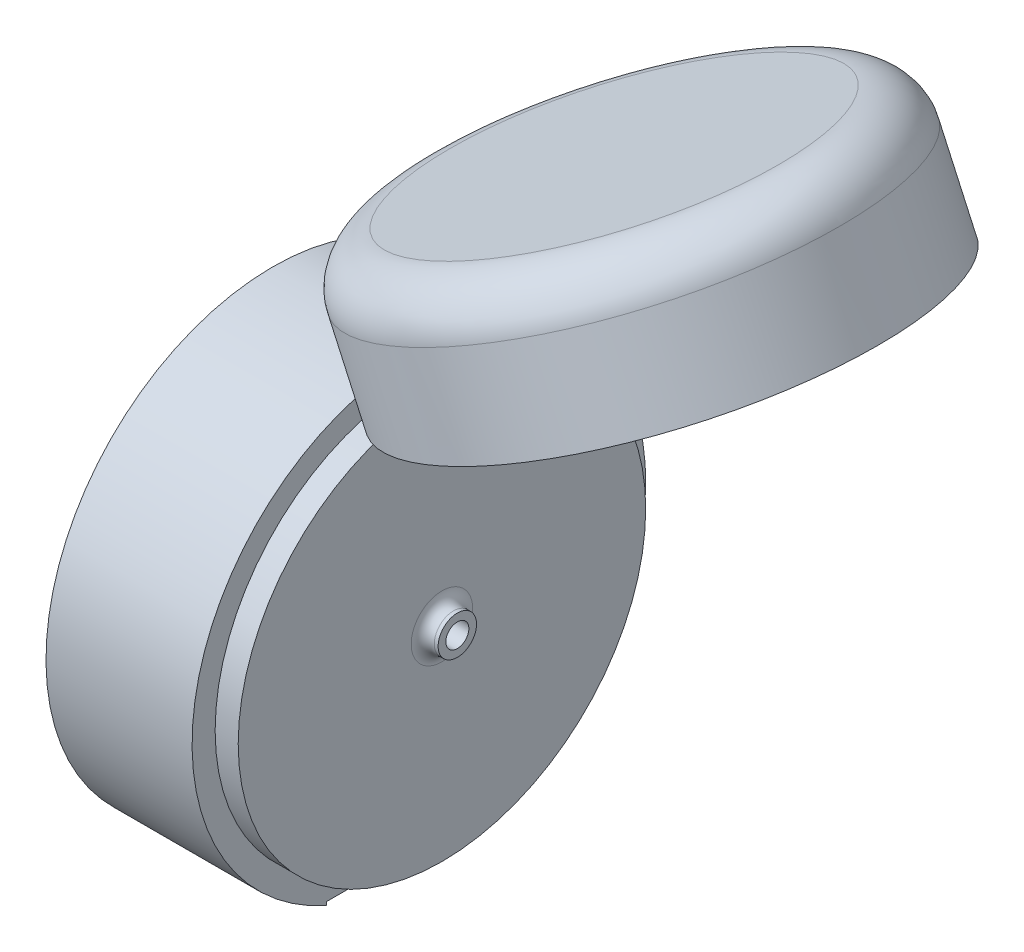
ISO-10303-21;
HEADER;
FILE_DESCRIPTION(('STEP AP214'),'2;1');
FILE_NAME('part.step','',(''),(''),'','','');
FILE_SCHEMA(('AUTOMOTIVE_DESIGN { 1 0 10303 214 1 1 1 1 }'));
ENDSEC;
DATA;
#1=APPLICATION_CONTEXT('core data for automotive mechanical design processes');
#2=APPLICATION_PROTOCOL_DEFINITION('international standard','automotive_design',2000,#1);
#3=PRODUCT_CONTEXT('',#1,'mechanical');
#4=PRODUCT('Part','Part','',(#3));
#5=PRODUCT_RELATED_PRODUCT_CATEGORY('part','',(#4));
#6=PRODUCT_DEFINITION_FORMATION('','',#4);
#7=PRODUCT_DEFINITION_CONTEXT('part definition',#1,'design');
#8=PRODUCT_DEFINITION('design','',#6,#7);
#9=PRODUCT_DEFINITION_SHAPE('','',#8);
#10=(LENGTH_UNIT() NAMED_UNIT(*) SI_UNIT(.MILLI.,.METRE.));
#11=(NAMED_UNIT(*) PLANE_ANGLE_UNIT() SI_UNIT($,.RADIAN.));
#12=(NAMED_UNIT(*) SI_UNIT($,.STERADIAN.) SOLID_ANGLE_UNIT());
#13=UNCERTAINTY_MEASURE_WITH_UNIT(LENGTH_MEASURE(1.E-05),#10,'distance_accuracy_value','');
#14=(GEOMETRIC_REPRESENTATION_CONTEXT(3) GLOBAL_UNCERTAINTY_ASSIGNED_CONTEXT((#13)) GLOBAL_UNIT_ASSIGNED_CONTEXT((#10,
#11,#12)) REPRESENTATION_CONTEXT('',''));
#15=CARTESIAN_POINT('',(0.,0.,0.));
#16=DIRECTION('',(0.,0.,1.));
#17=DIRECTION('',(1.,0.,0.));
#18=AXIS2_PLACEMENT_3D('',#15,#16,#17);
#19=CARTESIAN_POINT('',(9.5,0.,0.));
#20=DIRECTION('',(-1.,0.,0.));
#21=DIRECTION('',(0.,0.,1.));
#22=AXIS2_PLACEMENT_3D('',#19,#20,#21);
#23=CYLINDRICAL_SURFACE('',#22,14.75);
#24=CARTESIAN_POINT('',(0.,0.,0.));
#25=DIRECTION('',(1.,0.,0.));
#26=DIRECTION('',(0.,0.,-1.));
#27=AXIS2_PLACEMENT_3D('',#24,#25,#26);
#28=CIRCLE('',#27,14.75);
#29=CARTESIAN_POINT('',(0.,0.,-14.75));
#30=VERTEX_POINT('',#29);
#31=EDGE_CURVE('E394',#30,#30,#28,.T.);
#32=ORIENTED_EDGE('',*,*,#31,.T.);
#33=EDGE_LOOP('',(#32));
#34=FACE_BOUND('',#33,.T.);
#35=CARTESIAN_POINT('',(2.,0.,0.));
#36=DIRECTION('',(1.,0.,0.));
#37=DIRECTION('',(0.,0.,-1.));
#38=AXIS2_PLACEMENT_3D('',#35,#36,#37);
#39=CIRCLE('',#38,14.75);
#40=CARTESIAN_POINT('',(2.,-14.7160626527614,1.));
#41=VERTEX_POINT('',#40);
#42=CARTESIAN_POINT('',(2.,-14.7160626527614,-1.));
#43=VERTEX_POINT('',#42);
#44=EDGE_CURVE('E365',#41,#43,#39,.T.);
#45=ORIENTED_EDGE('',*,*,#44,.F.);
#46=CARTESIAN_POINT('',(2.,-14.7160626527614,1.));
#47=CARTESIAN_POINT('',(2.0281221774908,-14.7086683335928,1.10896231716254));
#48=CARTESIAN_POINT('',(2.06084206750302,-14.7001253458484,1.21664592471567));
#49=CARTESIAN_POINT('',(2.13514850023795,-14.681027448218,1.42870103315908));
#50=CARTESIAN_POINT('',(2.17673315523214,-14.6704729667251,1.53307323377716));
#51=CARTESIAN_POINT('',(2.26840121611016,-14.6476469003942,1.73768316659525));
#52=CARTESIAN_POINT('',(2.31847505026421,-14.635377252147,1.8379253989135));
#53=CARTESIAN_POINT('',(2.42674332777425,-14.6094595051699,2.0337051412248));
#54=CARTESIAN_POINT('',(2.48493793291973,-14.5958113789782,2.12924255743284));
#55=CARTESIAN_POINT('',(2.67107821477595,-14.5533529923813,2.40781797824088));
#56=CARTESIAN_POINT('',(2.81067277434549,-14.523004673537,2.58302452696941));
#57=CARTESIAN_POINT('',(3.11687790135848,-14.4615423272579,2.90751597757197));
#58=CARTESIAN_POINT('',(3.28347068604907,-14.4304288151933,3.05681780881786));
#59=CARTESIAN_POINT('',(3.58266998299508,-14.3803254846725,3.28292381521356));
#60=CARTESIAN_POINT('',(3.70922269109669,-14.3606282429431,3.36767958954601));
#61=CARTESIAN_POINT('',(3.97127090818296,-14.323480104072,3.5223079634277));
#62=CARTESIAN_POINT('',(4.1067587059451,-14.306027307321,3.59219318206383));
#63=CARTESIAN_POINT('',(4.24603677390421,-14.2901873727789,3.6541818305704));
#64=B_SPLINE_CURVE_WITH_KNOTS('',3,(#46,#47,#48,#49,#50,#51,#52,#53,#54,#55,#56,#57,#58,#59,#60,
#61,#62,#63),.UNSPECIFIED.,.F.,.F.,(4,2,2,2,2,2,2,2,4),(0.,0.338199503792019,0.676327060698384,
1.01407587676397,1.35183142273411,2.02667156748196,2.70106901265029,3.16086841590994,
3.62027606550659),.UNSPECIFIED.);
#65=CARTESIAN_POINT('',(4.24603677390421,-14.2901873727789,3.6541818305704));
#66=VERTEX_POINT('',#65);
#67=EDGE_CURVE('E311',#41,#66,#64,.T.);
#68=ORIENTED_EDGE('',*,*,#67,.T.);
#69=CARTESIAN_POINT('',(-3.96138999608952,0.,0.));
#70=DIRECTION('',(-0.406736643075801,0.,0.9135454576426));
#71=DIRECTION('',(-0.913545457642601,0.,-0.406736643075801));
#72=AXIS2_PLACEMENT_3D('',#69,#70,#71);
#73=ELLIPSE('',#72,36.2642516997199,14.75);
#74=CARTESIAN_POINT('',(9.5,-13.477451270748,5.99339697038443));
#75=VERTEX_POINT('',#74);
#76=EDGE_CURVE('E193',#66,#75,#73,.T.);
#77=ORIENTED_EDGE('',*,*,#76,.T.);
#78=CARTESIAN_POINT('',(9.5,0.,0.));
#79=DIRECTION('',(1.,0.,0.));
#80=DIRECTION('',(0.,0.,-1.));
#81=AXIS2_PLACEMENT_3D('',#78,#79,#80);
#82=CIRCLE('',#81,14.75);
#83=CARTESIAN_POINT('',(9.5,14.479000955853,2.81443268180418));
#84=VERTEX_POINT('',#83);
#85=EDGE_CURVE('E184',#84,#75,#82,.T.);
#86=ORIENTED_EDGE('',*,*,#85,.F.);
#87=DIRECTION('',(-1.,0.,0.));
#88=VECTOR('',#87,1.);
#89=CARTESIAN_POINT('',(0.,14.479000955853,2.81443268180418));
#90=LINE('',#89,#88);
#91=CARTESIAN_POINT('',(8.,14.479000955853,2.81443268180418));
#92=VERTEX_POINT('',#91);
#93=EDGE_CURVE('E419',#84,#92,#90,.T.);
#94=ORIENTED_EDGE('',*,*,#93,.T.);
#95=CARTESIAN_POINT('',(8.,0.,0.));
#96=DIRECTION('',(1.,0.,0.));
#97=DIRECTION('',(0.,0.,-1.));
#98=AXIS2_PLACEMENT_3D('',#95,#96,#97);
#99=CIRCLE('',#98,14.75);
#100=CARTESIAN_POINT('',(8.,14.479000955853,-2.81443268180418));
#101=VERTEX_POINT('',#100);
#102=EDGE_CURVE('E417',#101,#92,#99,.T.);
#103=ORIENTED_EDGE('',*,*,#102,.F.);
#104=DIRECTION('',(-1.,0.,0.));
#105=VECTOR('',#104,1.);
#106=CARTESIAN_POINT('',(0.,14.479000955853,-2.81443268180418));
#107=LINE('',#106,#105);
#108=CARTESIAN_POINT('',(9.5,14.479000955853,-2.81443268180418));
#109=VERTEX_POINT('',#108);
#110=EDGE_CURVE('E389',#109,#101,#107,.T.);
#111=ORIENTED_EDGE('',*,*,#110,.F.);
#112=CARTESIAN_POINT('',(9.5,-13.477451270748,-5.99339697038443));
#113=VERTEX_POINT('',#112);
#114=EDGE_CURVE('E390',#113,#109,#82,.T.);
#115=ORIENTED_EDGE('',*,*,#114,.F.);
#116=CARTESIAN_POINT('',(-3.96138999608952,0.,0.));
#117=DIRECTION('',(0.406736643075801,0.,0.9135454576426));
#118=DIRECTION('',(-0.913545457642601,0.,0.406736643075801));
#119=AXIS2_PLACEMENT_3D('',#116,#117,#118);
#120=ELLIPSE('',#119,36.2642516997199,14.75);
#121=CARTESIAN_POINT('',(4.24603677390421,-14.2901873727789,-3.6541818305704));
#122=VERTEX_POINT('',#121);
#123=EDGE_CURVE('E196',#122,#113,#120,.T.);
#124=ORIENTED_EDGE('',*,*,#123,.F.);
#125=CARTESIAN_POINT('',(2.,-14.7160626527614,-1.));
#126=CARTESIAN_POINT('',(2.0281221774908,-14.7086683335928,-1.10896231716254));
#127=CARTESIAN_POINT('',(2.06084206750302,-14.7001253458484,-1.21664592471567));
#128=CARTESIAN_POINT('',(2.13514850023795,-14.681027448218,-1.42870103315908));
#129=CARTESIAN_POINT('',(2.17673315523214,-14.6704729667251,-1.53307323377716));
#130=CARTESIAN_POINT('',(2.26840121611016,-14.6476469003942,-1.73768316659525));
#131=CARTESIAN_POINT('',(2.31847505026421,-14.635377252147,-1.8379253989135));
#132=CARTESIAN_POINT('',(2.42674332777425,-14.6094595051699,-2.0337051412248));
#133=CARTESIAN_POINT('',(2.48493793291973,-14.5958113789782,-2.12924255743284));
#134=CARTESIAN_POINT('',(2.67107821477595,-14.5533529923813,-2.40781797824088));
#135=CARTESIAN_POINT('',(2.81067277434548,-14.523004673537,-2.58302452696941));
#136=CARTESIAN_POINT('',(3.11687790135848,-14.4615423272579,-2.90751597757197));
#137=CARTESIAN_POINT('',(3.28347068604907,-14.4304288151933,-3.05681780881786));
#138=CARTESIAN_POINT('',(3.58266998299508,-14.3803254846725,-3.28292381521356));
#139=CARTESIAN_POINT('',(3.70922269109669,-14.3606282429431,-3.36767958954601));
#140=CARTESIAN_POINT('',(3.97127090818296,-14.323480104072,-3.5223079634277));
#141=CARTESIAN_POINT('',(4.1067587059451,-14.306027307321,-3.59219318206383));
#142=CARTESIAN_POINT('',(4.24603677390421,-14.2901873727789,-3.6541818305704));
#143=B_SPLINE_CURVE_WITH_KNOTS('',3,(#125,#126,#127,#128,#129,#130,#131,#132,#133,#134,#135,
#136,#137,#138,#139,#140,#141,#142),.UNSPECIFIED.,.F.,.F.,(4,2,2,2,2,2,2,2,4),(0.,
0.33819950379202,0.676327060698385,1.01407587676397,1.35183142273411,2.02667156748196,
2.70106901265029,3.16086841590994,3.62027606550659),.UNSPECIFIED.);
#144=EDGE_CURVE('E303',#43,#122,#143,.T.);
#145=ORIENTED_EDGE('',*,*,#144,.F.);
#146=EDGE_LOOP('',(#45,#68,#77,#86,#94,#103,#111,#115,#124,#145));
#147=FACE_BOUND('',#146,.T.);
#148=ADVANCED_FACE('F56',(#34,#147),#23,.T.);
#149=CARTESIAN_POINT('',(9.5,0.,0.));
#150=DIRECTION('',(1.,0.,0.));
#151=DIRECTION('',(0.,0.,-1.));
#152=AXIS2_PLACEMENT_3D('',#149,#150,#151);
#153=PLANE('',#152);
#154=DIRECTION('',(0.,0.,1.));
#155=VECTOR('',#154,1.);
#156=CARTESIAN_POINT('',(9.5,-13.25,0.));
#157=LINE('',#156,#155);
#158=CARTESIAN_POINT('',(9.5,-13.25,-5.99339697038443));
#159=VERTEX_POINT('',#158);
#160=CARTESIAN_POINT('',(9.5,-13.25,0.));
#161=VERTEX_POINT('',#160);
#162=EDGE_CURVE('E167',#159,#161,#157,.T.);
#163=ORIENTED_EDGE('',*,*,#162,.F.);
#164=DIRECTION('',(0.,-1.,0.));
#165=VECTOR('',#164,1.);
#166=CARTESIAN_POINT('',(9.5,-13.25,-5.99339697038443));
#167=LINE('',#166,#165);
#168=EDGE_CURVE('E197',#159,#113,#167,.T.);
#169=ORIENTED_EDGE('',*,*,#168,.T.);
#170=ORIENTED_EDGE('',*,*,#114,.T.);
#171=DIRECTION('',(0.,0.981627183447662,-0.190808995376554));
#172=VECTOR('',#171,1.);
#173=CARTESIAN_POINT('',(9.5,0.,0.));
#174=LINE('',#173,#172);
#175=CARTESIAN_POINT('',(9.5,15.9514417310245,-3.10064617486901));
#176=VERTEX_POINT('',#175);
#177=EDGE_CURVE('E450',#109,#176,#174,.T.);
#178=ORIENTED_EDGE('',*,*,#177,.T.);
#179=CARTESIAN_POINT('',(9.5,0.,0.));
#180=DIRECTION('',(1.,0.,0.));
#181=DIRECTION('',(0.,0.,-1.));
#182=AXIS2_PLACEMENT_3D('',#179,#180,#181);
#183=CIRCLE('',#182,16.25);
#184=CARTESIAN_POINT('',(9.5,15.9514417310245,3.10064617486901));
#185=VERTEX_POINT('',#184);
#186=EDGE_CURVE('E446',#176,#185,#183,.T.);
#187=ORIENTED_EDGE('',*,*,#186,.T.);
#188=DIRECTION('',(0.,0.981627183447662,0.190808995376554));
#189=VECTOR('',#188,1.);
#190=CARTESIAN_POINT('',(9.5,0.,0.));
#191=LINE('',#190,#189);
#192=EDGE_CURVE('E422',#84,#185,#191,.T.);
#193=ORIENTED_EDGE('',*,*,#192,.F.);
#194=ORIENTED_EDGE('',*,*,#85,.T.);
#195=DIRECTION('',(0.,-1.,0.));
#196=VECTOR('',#195,1.);
#197=CARTESIAN_POINT('',(9.5,-13.25,5.99339697038443));
#198=LINE('',#197,#196);
#199=CARTESIAN_POINT('',(9.5,-13.25,5.99339697038443));
#200=VERTEX_POINT('',#199);
#201=EDGE_CURVE('E73',#200,#75,#198,.T.);
#202=ORIENTED_EDGE('',*,*,#201,.F.);
#203=EDGE_CURVE('E165',#161,#200,#157,.T.);
#204=ORIENTED_EDGE('',*,*,#203,.F.);
#205=CARTESIAN_POINT('',(9.5,0.,0.));
#206=DIRECTION('',(1.,0.,0.));
#207=DIRECTION('',(0.,0.,-1.));
#208=AXIS2_PLACEMENT_3D('',#205,#206,#207);
#209=CIRCLE('',#208,13.25);
#210=EDGE_CURVE('E395',#161,#161,#209,.T.);
#211=ORIENTED_EDGE('',*,*,#210,.F.);
#212=EDGE_LOOP('',(#163,#169,#170,#178,#187,#193,#194,#202,#204,#211));
#213=FACE_BOUND('',#212,.T.);
#214=ADVANCED_FACE('F182',(#213),#153,.T.);
#215=CARTESIAN_POINT('',(12.9029318413498,0.,0.));
#216=DIRECTION('',(1.,0.,0.));
#217=DIRECTION('',(0.,0.,-1.));
#218=AXIS2_PLACEMENT_3D('',#215,#216,#217);
#219=CONICAL_SURFACE('',#218,18.2349608713586,0.435992947642129);
#220=CARTESIAN_POINT('',(12.9029903151345,17.8999221557785,3.47959456459471));
#221=CARTESIAN_POINT('',(12.8543674494344,17.9091743068573,3.31329674046829));
#222=CARTESIAN_POINT('',(12.8090853766778,17.9179165528343,3.14601142862205));
#223=CARTESIAN_POINT('',(12.7253750648273,17.9342543827507,2.80966817153869));
#224=CARTESIAN_POINT('',(12.686947288863,17.9418498892021,2.64061010733715));
#225=CARTESIAN_POINT('',(12.5821986447729,17.9627270737572,2.13104439629364));
#226=CARTESIAN_POINT('',(12.5264326088184,17.9740955057353,1.78821382184558));
#227=CARTESIAN_POINT('',(12.4451713310823,17.9907765674522,1.10734482551051));
#228=CARTESIAN_POINT('',(12.4189725680017,17.9962298140188,0.769392767511571));
#229=CARTESIAN_POINT('',(12.3949383577163,18.0012290142844,0.0925325319721335));
#230=CARTESIAN_POINT('',(12.3970912979042,18.0007773865684,-0.246375197269454));
#231=CARTESIAN_POINT('',(12.4250881387634,17.9949613461024,-0.827480178591431));
#232=CARTESIAN_POINT('',(12.4440929148349,17.9910155697877,-1.07004744989232));
#233=CARTESIAN_POINT('',(12.4964996422172,17.9802301738296,-1.55355667885761));
#234=CARTESIAN_POINT('',(12.5299009368585,17.9733906861776,-1.79449871014516));
#235=CARTESIAN_POINT('',(12.6115126943946,17.9568837632327,-2.27820196641815));
#236=CARTESIAN_POINT('',(12.6599779178275,17.9471678272921,-2.5209183652724));
#237=CARTESIAN_POINT('',(12.7710202585832,17.9252932412367,-3.00297946863874));
#238=CARTESIAN_POINT('',(12.8335966219168,17.9131347216383,-3.24232435257253));
#239=CARTESIAN_POINT('',(12.9029903151345,17.8999221557785,-3.47959456459471));
#240=B_SPLINE_CURVE_WITH_KNOTS('',3,(#220,#221,#222,#223,#224,#225,#226,#227,#228,#229,#230,
#231,#232,#233,#234,#235,#236,#237,#238,#239),.UNSPECIFIED.,.F.,.F.,(4,2,2,2,2,2,2,2,2,4),(0.,
0.520448910628168,1.04093297352421,2.08211521273926,3.09796384375708,4.11339640509149,
4.84300446024263,5.57257923925052,6.31523369479725,7.05784847809041),.UNSPECIFIED.);
#241=CARTESIAN_POINT('',(12.9029318413498,17.89993328043,3.47939456459471));
#242=VERTEX_POINT('',#241);
#243=CARTESIAN_POINT('',(12.9029318413498,17.89993328043,-3.47939456459471));
#244=VERTEX_POINT('',#243);
#245=EDGE_CURVE('E249',#242,#244,#240,.T.);
#246=ORIENTED_EDGE('',*,*,#245,.F.);
#247=DIRECTION('',(-0.906451156841727,-0.414551631514919,-0.0805806742874196));
#248=VECTOR('',#247,1.);
#249=CARTESIAN_POINT('',(-4.67922568655713,9.85900130772278,1.91639572198442));
#250=LINE('',#249,#248);
#251=CARTESIAN_POINT('',(10.1835783708246,16.6562783858853,3.23765254173245));
#252=VERTEX_POINT('',#251);
#253=EDGE_CURVE('E484',#242,#252,#250,.T.);
#254=ORIENTED_EDGE('',*,*,#253,.T.);
#255=CARTESIAN_POINT('',(10.1835783708246,0.,0.));
#256=DIRECTION('',(1.,0.,0.));
#257=DIRECTION('',(0.,0.,-1.));
#258=AXIS2_PLACEMENT_3D('',#255,#256,#257);
#259=CIRCLE('',#258,16.9680288675231);
#260=CARTESIAN_POINT('',(10.1835783708246,16.6562783858853,-3.23765254173245));
#261=VERTEX_POINT('',#260);
#262=EDGE_CURVE('E457',#261,#252,#259,.T.);
#263=ORIENTED_EDGE('',*,*,#262,.F.);
#264=DIRECTION('',(-0.906451156841727,-0.414551631514919,0.0805806742874196));
#265=VECTOR('',#264,1.);
#266=CARTESIAN_POINT('',(-4.67922568655713,9.85900130772278,-1.91639572198443));
#267=LINE('',#266,#265);
#268=EDGE_CURVE('E432',#244,#261,#267,.T.);
#269=ORIENTED_EDGE('',*,*,#268,.F.);
#270=EDGE_LOOP('',(#246,#254,#263,#269));
#271=FACE_BOUND('',#270,.T.);
#272=ADVANCED_FACE('F261',(#271),#219,.F.);
#273=CARTESIAN_POINT('',(12.269465839432,0.,0.));
#274=DIRECTION('',(-1.,0.,0.));
#275=DIRECTION('',(0.,0.,1.));
#276=AXIS2_PLACEMENT_3D('',#273,#274,#275);
#277=CONICAL_SURFACE('',#276,19.5946376066212,1.13480337915277);
#278=CARTESIAN_POINT('',(12.9030233082899,17.89973328043,-3.47939456454243));
#279=CARTESIAN_POINT('',(12.7974816942669,18.1305024287753,-3.479383960213));
#280=CARTESIAN_POINT('',(12.6918977636937,18.3612518751685,-3.47918094029057));
#281=CARTESIAN_POINT('',(12.4806452740707,18.8227113539502,-3.47839006927702));
#282=CARTESIAN_POINT('',(12.3749767150247,19.0534213863405,-3.47780221820274));
#283=CARTESIAN_POINT('',(12.269265839432,19.2841117167804,-3.47702195155231));
#284=B_SPLINE_CURVE_WITH_KNOTS('',3,(#278,#279,#280,#281,#282,#283),.UNSPECIFIED.,.F.,.F.,(4,2,
4),(0.,0.761275135288405,1.52255023725048),.UNSPECIFIED.);
#285=CARTESIAN_POINT('',(12.269465839432,19.2836752501048,-3.47702340850744));
#286=VERTEX_POINT('',#285);
#287=EDGE_CURVE('E242',#244,#286,#284,.T.);
#288=ORIENTED_EDGE('',*,*,#287,.F.);
#289=DIRECTION('',(0.42231066794517,-0.889797096023419,0.172959034594885));
#290=VECTOR('',#289,1.);
#291=CARTESIAN_POINT('',(17.5821575279069,8.04093197270724,-1.56299884261028));
#292=LINE('',#291,#290);
#293=CARTESIAN_POINT('',(12.269465839432,19.2346289244652,-3.73883311648704));
#294=VERTEX_POINT('',#293);
#295=EDGE_CURVE('E440',#294,#244,#292,.T.);
#296=ORIENTED_EDGE('',*,*,#295,.F.);
#297=CARTESIAN_POINT('',(12.269465839432,0.,0.));
#298=DIRECTION('',(1.,0.,0.));
#299=DIRECTION('',(0.,0.,-1.));
#300=AXIS2_PLACEMENT_3D('',#297,#298,#299);
#301=CIRCLE('',#300,19.5946376066212);
#302=EDGE_CURVE('E454',#294,#286,#301,.T.);
#303=ORIENTED_EDGE('',*,*,#302,.T.);
#304=EDGE_LOOP('',(#288,#296,#303));
#305=FACE_BOUND('',#304,.T.);
#306=ADVANCED_FACE('F260',(#305),#277,.T.);
#307=CARTESIAN_POINT('',(12.269265839432,19.2841117167804,3.47702195155222));
#308=CARTESIAN_POINT('',(12.3749767150247,19.0534213863405,3.47780221820269));
#309=CARTESIAN_POINT('',(12.4806452740707,18.8227113539502,3.47839006927699));
#310=CARTESIAN_POINT('',(12.6918977636937,18.3612518751685,3.4791809402906));
#311=CARTESIAN_POINT('',(12.7974816942669,18.1305024287753,3.47938396021306));
#312=CARTESIAN_POINT('',(12.9030233082899,17.89973328043,3.4793945645425));
#313=B_SPLINE_CURVE_WITH_KNOTS('',3,(#307,#308,#309,#310,#311,#312),.UNSPECIFIED.,.F.,.F.,(4,2,
4),(0.,0.761275101962074,1.52255023725048),.UNSPECIFIED.);
#314=CARTESIAN_POINT('',(12.269465839432,19.2836752501048,3.47702340850743));
#315=VERTEX_POINT('',#314);
#316=EDGE_CURVE('E218',#315,#242,#313,.T.);
#317=ORIENTED_EDGE('',*,*,#316,.F.);
#318=CARTESIAN_POINT('',(12.269465839432,19.2346289244652,3.73883311648704));
#319=VERTEX_POINT('',#318);
#320=EDGE_CURVE('E453',#315,#319,#301,.T.);
#321=ORIENTED_EDGE('',*,*,#320,.T.);
#322=DIRECTION('',(0.42231066794517,-0.889797096023419,-0.172959034594885));
#323=VECTOR('',#322,1.);
#324=CARTESIAN_POINT('',(17.5821575279069,8.04093197270724,1.56299884261028));
#325=LINE('',#324,#323);
#326=EDGE_CURVE('E481',#319,#242,#325,.T.);
#327=ORIENTED_EDGE('',*,*,#326,.T.);
#328=EDGE_LOOP('',(#317,#321,#327));
#329=FACE_BOUND('',#328,.T.);
#330=ADVANCED_FACE('F259',(#329),#277,.T.);
#331=CARTESIAN_POINT('',(9.5,0.,0.));
#332=DIRECTION('',(1.,0.,0.));
#333=DIRECTION('',(0.,0.,-1.));
#334=AXIS2_PLACEMENT_3D('',#331,#332,#333);
#335=CONICAL_SURFACE('',#334,18.3032144766954,0.436332312998579);
#336=CARTESIAN_POINT('',(12.269665839432,19.2836443649741,-3.47772020158941));
#337=CARTESIAN_POINT('',(12.2207889024844,19.2911938347647,-3.30745625714601));
#338=CARTESIAN_POINT('',(12.1753678147678,19.2983346468691,-3.13620072935886));
#339=CARTESIAN_POINT('',(12.0916045155892,19.3116775119999,-2.79192073427498));
#340=CARTESIAN_POINT('',(12.0532627369126,19.3178795076288,-2.61889615951156));
#341=CARTESIAN_POINT('',(11.949102409555,19.3348959009556,-2.09745610610004));
#342=CARTESIAN_POINT('',(11.89416743728,19.3441177649897,-1.74673870036708));
#343=CARTESIAN_POINT('',(11.8153371200995,19.3574545902254,-1.05020826187473));
#344=CARTESIAN_POINT('',(11.790736642578,19.361685462652,-0.704476134189962));
#345=CARTESIAN_POINT('',(11.7706702826635,19.3651309186228,-0.0122399644828495));
#346=CARTESIAN_POINT('',(11.775192203281,19.3643476022011,0.334263693632252));
#347=CARTESIAN_POINT('',(11.8071390769046,19.3588780881148,0.914698308266651));
#348=CARTESIAN_POINT('',(11.8267565977433,19.3555236561437,1.14910518265975));
#349=CARTESIAN_POINT('',(11.8791999139535,19.3466490081417,1.61639420427881));
#350=CARTESIAN_POINT('',(11.9120249631112,19.3411289144692,1.84927643689036));
#351=CARTESIAN_POINT('',(11.991267954786,19.3279923861597,2.31660436528746));
#352=CARTESIAN_POINT('',(12.0379011948311,19.3203428721778,2.55101247980283));
#353=CARTESIAN_POINT('',(12.1441475095402,19.3032618497521,3.01680583678768));
#354=CARTESIAN_POINT('',(12.2037606165431,19.2938303368686,3.24819107172421));
#355=CARTESIAN_POINT('',(12.269665839432,19.2836443649741,3.47772020158941));
#356=B_SPLINE_CURVE_WITH_KNOTS('',3,(#336,#337,#338,#339,#340,#341,#342,#343,#344,#345,#346,
#347,#348,#349,#350,#351,#352,#353,#354,#355),.UNSPECIFIED.,.F.,.F.,(4,2,2,2,2,2,2,2,2,4),(0.,
0.531828465391807,1.06368943275162,2.12761200139817,3.16630651439136,4.20456603154485,
4.90996207179597,5.61531826338885,6.33231009227307,7.0493037075416),.UNSPECIFIED.);
#357=EDGE_CURVE('E85',#286,#315,#356,.T.);
#358=ORIENTED_EDGE('',*,*,#357,.F.);
#359=ORIENTED_EDGE('',*,*,#302,.F.);
#360=DIRECTION('',(0.906307787036651,0.414853573946068,-0.0806393659505282));
#361=VECTOR('',#360,1.);
#362=CARTESIAN_POINT('',(-5.31377901655471,11.1860696221937,-2.17435167119817));
#363=LINE('',#362,#361);
#364=CARTESIAN_POINT('',(9.5,17.9669328747969,-3.49241796645985));
#365=VERTEX_POINT('',#364);
#366=EDGE_CURVE('E439',#365,#294,#363,.T.);
#367=ORIENTED_EDGE('',*,*,#366,.F.);
#368=CARTESIAN_POINT('',(9.5,0.,0.));
#369=DIRECTION('',(1.,0.,0.));
#370=DIRECTION('',(0.,0.,-1.));
#371=AXIS2_PLACEMENT_3D('',#368,#369,#370);
#372=CIRCLE('',#371,18.3032144766954);
#373=CARTESIAN_POINT('',(9.5,17.9669328747969,3.49241796645985));
#374=VERTEX_POINT('',#373);
#375=EDGE_CURVE('E455',#365,#374,#372,.T.);
#376=ORIENTED_EDGE('',*,*,#375,.T.);
#377=DIRECTION('',(0.906307787036651,0.414853573946068,0.0806393659505282));
#378=VECTOR('',#377,1.);
#379=CARTESIAN_POINT('',(-5.31377901655471,11.1860696221937,2.17435167119816));
#380=LINE('',#379,#378);
#381=EDGE_CURVE('E426',#374,#319,#380,.T.);
#382=ORIENTED_EDGE('',*,*,#381,.T.);
#383=ORIENTED_EDGE('',*,*,#320,.F.);
#384=EDGE_LOOP('',(#358,#359,#367,#376,#382,#383));
#385=FACE_BOUND('',#384,.T.);
#386=ADVANCED_FACE('F228',(#385),#335,.T.);
#387=CARTESIAN_POINT('',(0.,0.,0.));
#388=DIRECTION('',(1.,0.,0.));
#389=DIRECTION('',(0.,0.,-1.));
#390=AXIS2_PLACEMENT_3D('',#387,#388,#389);
#391=PLANE('',#390);
#392=CARTESIAN_POINT('',(0.,0.,0.));
#393=DIRECTION('',(1.,0.,0.));
#394=DIRECTION('',(0.,0.,-1.));
#395=AXIS2_PLACEMENT_3D('',#392,#393,#394);
#396=CIRCLE('',#395,11.75);
#397=CARTESIAN_POINT('',(0.,0.,-11.75));
#398=VERTEX_POINT('',#397);
#399=EDGE_CURVE('E458',#398,#398,#396,.T.);
#400=ORIENTED_EDGE('',*,*,#399,.T.);
#401=EDGE_LOOP('',(#400));
#402=FACE_BOUND('',#401,.T.);
#403=ORIENTED_EDGE('',*,*,#31,.F.);
#404=EDGE_LOOP('',(#403));
#405=FACE_BOUND('',#404,.T.);
#406=ADVANCED_FACE('F285',(#402,#405),#391,.F.);
#407=CARTESIAN_POINT('',(11.,0.,0.));
#408=DIRECTION('',(1.,0.,0.));
#409=DIRECTION('',(0.,0.,-1.));
#410=AXIS2_PLACEMENT_3D('',#407,#408,#409);
#411=PLANE('',#410);
#412=CARTESIAN_POINT('',(11.,0.,0.));
#413=DIRECTION('',(1.,0.,0.));
#414=DIRECTION('',(0.,0.,-1.));
#415=AXIS2_PLACEMENT_3D('',#412,#413,#414);
#416=CIRCLE('',#415,2.);
#417=CARTESIAN_POINT('',(11.,0.,-2.));
#418=VERTEX_POINT('',#417);
#419=EDGE_CURVE('E797',#418,#418,#416,.F.);
#420=ORIENTED_EDGE('',*,*,#419,.T.);
#421=EDGE_LOOP('',(#420));
#422=FACE_BOUND('',#421,.T.);
#423=CARTESIAN_POINT('',(11.,0.,0.));
#424=DIRECTION('',(1.,0.,0.));
#425=DIRECTION('',(0.,0.,-1.));
#426=AXIS2_PLACEMENT_3D('',#423,#424,#425);
#427=CIRCLE('',#426,13.25);
#428=CARTESIAN_POINT('',(11.,0.,-13.25));
#429=VERTEX_POINT('',#428);
#430=EDGE_CURVE('E397',#429,#429,#427,.T.);
#431=ORIENTED_EDGE('',*,*,#430,.T.);
#432=EDGE_LOOP('',(#431));
#433=FACE_BOUND('',#432,.T.);
#434=ADVANCED_FACE('F282',(#422,#433),#411,.T.);
#435=CARTESIAN_POINT('',(11.,0.,0.));
#436=DIRECTION('',(-1.,0.,0.));
#437=DIRECTION('',(0.,0.,1.));
#438=AXIS2_PLACEMENT_3D('',#435,#436,#437);
#439=CYLINDRICAL_SURFACE('',#438,13.25);
#440=ORIENTED_EDGE('',*,*,#430,.F.);
#441=EDGE_LOOP('',(#440));
#442=FACE_BOUND('',#441,.T.);
#443=ORIENTED_EDGE('',*,*,#210,.T.);
#444=EDGE_LOOP('',(#443));
#445=FACE_BOUND('',#444,.T.);
#446=ADVANCED_FACE('F279',(#442,#445),#439,.T.);
#447=CARTESIAN_POINT('',(11.,0.,0.));
#448=DIRECTION('',(-1.,0.,0.));
#449=DIRECTION('',(0.,0.,1.));
#450=AXIS2_PLACEMENT_3D('',#447,#448,#449);
#451=CYLINDRICAL_SURFACE('',#450,0.75);
#452=CARTESIAN_POINT('',(9.25,0.,0.));
#453=DIRECTION('',(1.,0.,0.));
#454=DIRECTION('',(0.,0.,-1.));
#455=AXIS2_PLACEMENT_3D('',#452,#453,#454);
#456=CIRCLE('',#455,0.75);
#457=CARTESIAN_POINT('',(9.25,0.,-0.75));
#458=VERTEX_POINT('',#457);
#459=EDGE_CURVE('E316',#458,#458,#456,.F.);
#460=ORIENTED_EDGE('',*,*,#459,.T.);
#461=EDGE_LOOP('',(#460));
#462=FACE_BOUND('',#461,.T.);
#463=CARTESIAN_POINT('',(12.,0.,0.));
#464=DIRECTION('',(1.,0.,0.));
#465=DIRECTION('',(0.,0.,-1.));
#466=AXIS2_PLACEMENT_3D('',#463,#464,#465);
#467=CIRCLE('',#466,0.75);
#468=CARTESIAN_POINT('',(12.,0.,-0.75));
#469=VERTEX_POINT('',#468);
#470=EDGE_CURVE('E811',#469,#469,#467,.T.);
#471=ORIENTED_EDGE('',*,*,#470,.T.);
#472=EDGE_LOOP('',(#471));
#473=FACE_BOUND('',#472,.T.);
#474=ADVANCED_FACE('F276',(#462,#473),#451,.F.);
#475=CARTESIAN_POINT('',(8.,0.,0.));
#476=DIRECTION('',(-1.,0.,0.));
#477=DIRECTION('',(0.,0.,1.));
#478=AXIS2_PLACEMENT_3D('',#475,#476,#477);
#479=CYLINDRICAL_SURFACE('',#478,11.75);
#480=CARTESIAN_POINT('',(8.,0.,0.));
#481=DIRECTION('',(1.,0.,0.));
#482=DIRECTION('',(0.,0.,-1.));
#483=AXIS2_PLACEMENT_3D('',#480,#481,#482);
#484=CIRCLE('',#483,11.75);
#485=CARTESIAN_POINT('',(8.,0.,-11.75));
#486=VERTEX_POINT('',#485);
#487=EDGE_CURVE('E460',#486,#486,#484,.T.);
#488=ORIENTED_EDGE('',*,*,#487,.T.);
#489=EDGE_LOOP('',(#488));
#490=FACE_BOUND('',#489,.T.);
#491=ORIENTED_EDGE('',*,*,#399,.F.);
#492=EDGE_LOOP('',(#491));
#493=FACE_BOUND('',#492,.T.);
#494=ADVANCED_FACE('F275',(#490,#493),#479,.F.);
#495=CARTESIAN_POINT('',(8.,0.,0.));
#496=DIRECTION('',(1.,0.,0.));
#497=DIRECTION('',(0.,0.,-1.));
#498=AXIS2_PLACEMENT_3D('',#495,#496,#497);
#499=PLANE('',#498);
#500=CARTESIAN_POINT('',(8.,0.,0.));
#501=DIRECTION('',(1.,0.,0.));
#502=DIRECTION('',(0.,0.,-1.));
#503=AXIS2_PLACEMENT_3D('',#500,#501,#502);
#504=CIRCLE('',#503,2.);
#505=CARTESIAN_POINT('',(8.,0.,-2.));
#506=VERTEX_POINT('',#505);
#507=EDGE_CURVE('E803',#506,#506,#504,.T.);
#508=ORIENTED_EDGE('',*,*,#507,.T.);
#509=EDGE_LOOP('',(#508));
#510=FACE_BOUND('',#509,.T.);
#511=ORIENTED_EDGE('',*,*,#487,.F.);
#512=EDGE_LOOP('',(#511));
#513=FACE_BOUND('',#512,.T.);
#514=ADVANCED_FACE('F269',(#510,#513),#499,.F.);
#515=CARTESIAN_POINT('',(10.8671567416492,0.,0.));
#516=DIRECTION('',(1.,0.,0.));
#517=DIRECTION('',(0.,0.,-1.));
#518=AXIS2_PLACEMENT_3D('',#515,#516,#517);
#519=TOROIDAL_SURFACE('',#518,15.6328432583508,1.5);
#520=ORIENTED_EDGE('',*,*,#262,.T.);
#521=CARTESIAN_POINT('',(10.8671567416492,15.3456238969736,2.98288711700505));
#522=DIRECTION('',(0.,-0.190808995376554,0.981627183447662));
#523=DIRECTION('',(1.,0.,0.));
#524=AXIS2_PLACEMENT_3D('',#521,#522,#523);
#525=CIRCLE('',#524,1.5);
#526=EDGE_CURVE('E477',#252,#185,#525,.T.);
#527=ORIENTED_EDGE('',*,*,#526,.T.);
#528=ORIENTED_EDGE('',*,*,#186,.F.);
#529=CARTESIAN_POINT('',(10.8671567416492,15.3456238969736,-2.98288711700505));
#530=DIRECTION('',(0.,0.190808995376554,0.981627183447662));
#531=DIRECTION('',(1.,0.,0.));
#532=AXIS2_PLACEMENT_3D('',#529,#530,#531);
#533=CIRCLE('',#532,1.5);
#534=EDGE_CURVE('E424',#261,#176,#533,.T.);
#535=ORIENTED_EDGE('',*,*,#534,.F.);
#536=EDGE_LOOP('',(#520,#527,#528,#535));
#537=FACE_BOUND('',#536,.T.);
#538=ADVANCED_FACE('F272',(#537),#519,.F.);
#539=CARTESIAN_POINT('',(10.8671567416492,0.,0.));
#540=DIRECTION('',(1.,0.,0.));
#541=DIRECTION('',(0.,0.,-1.));
#542=AXIS2_PLACEMENT_3D('',#539,#540,#541);
#543=TOROIDAL_SURFACE('',#542,15.6328432583508,3.);
#544=ORIENTED_EDGE('',*,*,#102,.T.);
#545=CARTESIAN_POINT('',(10.8671567416492,15.3456238969736,2.98288711700505));
#546=DIRECTION('',(0.,-0.190808995376554,0.981627183447662));
#547=DIRECTION('',(1.,0.,0.));
#548=AXIS2_PLACEMENT_3D('',#545,#546,#547);
#549=CIRCLE('',#548,3.);
#550=EDGE_CURVE('E421',#92,#374,#549,.F.);
#551=ORIENTED_EDGE('',*,*,#550,.T.);
#552=ORIENTED_EDGE('',*,*,#375,.F.);
#553=CARTESIAN_POINT('',(10.8671567416492,15.3456238969736,-2.98288711700505));
#554=DIRECTION('',(0.,0.190808995376554,0.981627183447662));
#555=DIRECTION('',(1.,0.,0.));
#556=AXIS2_PLACEMENT_3D('',#553,#554,#555);
#557=CIRCLE('',#556,3.);
#558=EDGE_CURVE('E442',#101,#365,#557,.F.);
#559=ORIENTED_EDGE('',*,*,#558,.F.);
#560=EDGE_LOOP('',(#544,#551,#552,#559));
#561=FACE_BOUND('',#560,.T.);
#562=ADVANCED_FACE('F491',(#561),#543,.T.);
#563=CARTESIAN_POINT('',(0.,0.,0.));
#564=DIRECTION('',(0.,0.190808995376554,0.981627183447662));
#565=DIRECTION('',(1.,0.,0.));
#566=AXIS2_PLACEMENT_3D('',#563,#564,#565);
#567=PLANE('',#566);
#568=ORIENTED_EDGE('',*,*,#534,.T.);
#569=ORIENTED_EDGE('',*,*,#177,.F.);
#570=ORIENTED_EDGE('',*,*,#110,.T.);
#571=ORIENTED_EDGE('',*,*,#558,.T.);
#572=ORIENTED_EDGE('',*,*,#366,.T.);
#573=ORIENTED_EDGE('',*,*,#295,.T.);
#574=ORIENTED_EDGE('',*,*,#268,.T.);
#575=EDGE_LOOP('',(#568,#569,#570,#571,#572,#573,#574));
#576=FACE_BOUND('',#575,.T.);
#577=ADVANCED_FACE('F492',(#576),#567,.F.);
#578=CARTESIAN_POINT('',(0.,0.,0.));
#579=DIRECTION('',(0.,-0.190808995376554,0.981627183447662));
#580=DIRECTION('',(1.,0.,0.));
#581=AXIS2_PLACEMENT_3D('',#578,#579,#580);
#582=PLANE('',#581);
#583=ORIENTED_EDGE('',*,*,#526,.F.);
#584=ORIENTED_EDGE('',*,*,#253,.F.);
#585=ORIENTED_EDGE('',*,*,#326,.F.);
#586=ORIENTED_EDGE('',*,*,#381,.F.);
#587=ORIENTED_EDGE('',*,*,#550,.F.);
#588=ORIENTED_EDGE('',*,*,#93,.F.);
#589=ORIENTED_EDGE('',*,*,#192,.T.);
#590=EDGE_LOOP('',(#583,#584,#585,#586,#587,#588,#589));
#591=FACE_BOUND('',#590,.T.);
#592=ADVANCED_FACE('F232',(#591),#582,.T.);
#593=CARTESIAN_POINT('',(22.1950260908583,32.0460740234779,0.));
#594=DIRECTION('',(0.415904114260467,-0.909408471337944,0.));
#595=DIRECTION('',(0.909408471337944,0.415904114260467,0.));
#596=AXIS2_PLACEMENT_3D('',#593,#594,#595);
#597=CYLINDRICAL_SURFACE('',#596,14.75);
#598=CARTESIAN_POINT('',(25.9381631192025,23.8613977814364,0.));
#599=DIRECTION('',(-0.415904114260467,0.909408471337944,0.));
#600=DIRECTION('',(-0.909408471337944,-0.415904114260467,0.));
#601=AXIS2_PLACEMENT_3D('',#598,#599,#600);
#602=CIRCLE('',#601,14.75);
#603=EDGE_CURVE('E207',#244,#242,#602,.T.);
#604=ORIENTED_EDGE('',*,*,#603,.T.);
#605=ORIENTED_EDGE('',*,*,#245,.T.);
#606=EDGE_LOOP('',(#604,#605));
#607=FACE_BOUND('',#606,.T.);
#608=ADVANCED_FACE('F230',(#607),#597,.T.);
#609=CARTESIAN_POINT('',(23.4427384336397,29.3178486094641,0.));
#610=DIRECTION('',(-0.415904114260467,0.909408471337944,0.));
#611=DIRECTION('',(-0.909408471337944,-0.415904114260467,0.));
#612=AXIS2_PLACEMENT_3D('',#609,#610,#611);
#613=CIRCLE('',#612,14.75);
#614=CARTESIAN_POINT('',(10.028963481405,23.1832629241222,0.));
#615=VERTEX_POINT('',#614);
#616=EDGE_CURVE('E356',#615,#615,#613,.F.);
#617=ORIENTED_EDGE('',*,*,#616,.T.);
#618=EDGE_LOOP('',(#617));
#619=FACE_BOUND('',#618,.T.);
#620=EDGE_CURVE('E209',#242,#244,#602,.T.);
#621=ORIENTED_EDGE('',*,*,#620,.T.);
#622=ORIENTED_EDGE('',*,*,#287,.T.);
#623=ORIENTED_EDGE('',*,*,#357,.T.);
#624=ORIENTED_EDGE('',*,*,#316,.T.);
#625=EDGE_LOOP('',(#621,#622,#623,#624));
#626=FACE_BOUND('',#625,.T.);
#627=ADVANCED_FACE('F234',(#619,#626),#597,.T.);
#628=CARTESIAN_POINT('',(-4.53833260329964,9.9234366135776,0.));
#629=DIRECTION('',(-0.415904114260467,0.909408471337944,0.));
#630=DIRECTION('',(-0.909408471337944,-0.415904114260467,0.));
#631=AXIS2_PLACEMENT_3D('',#628,#629,#630);
#632=PLANE('',#631);
#633=CARTESIAN_POINT('',(25.9381631192025,23.8613977814364,0.));
#634=DIRECTION('',(-0.415904114260467,0.909408471337944,0.));
#635=DIRECTION('',(-0.909408471337944,-0.415904114260467,0.));
#636=AXIS2_PLACEMENT_3D('',#633,#634,#635);
#637=CIRCLE('',#636,13.25);
#638=CARTESIAN_POINT('',(13.8885008739747,18.3506682674853,0.));
#639=VERTEX_POINT('',#638);
#640=EDGE_CURVE('E202',#639,#639,#637,.T.);
#641=ORIENTED_EDGE('',*,*,#640,.T.);
#642=EDGE_LOOP('',(#641));
#643=FACE_BOUND('',#642,.T.);
#644=ORIENTED_EDGE('',*,*,#620,.F.);
#645=ORIENTED_EDGE('',*,*,#603,.F.);
#646=EDGE_LOOP('',(#644,#645));
#647=FACE_BOUND('',#646,.T.);
#648=ADVANCED_FACE('F240',(#643,#647),#632,.F.);
#649=CARTESIAN_POINT('',(-8.28146963164383,18.1081128556191,0.));
#650=DIRECTION('',(-0.415904114260467,0.909408471337944,0.));
#651=DIRECTION('',(-0.909408471337944,-0.415904114260467,0.));
#652=AXIS2_PLACEMENT_3D('',#649,#650,#651);
#653=PLANE('',#652);
#654=CARTESIAN_POINT('',(22.1950260908583,32.0460740234779,0.));
#655=DIRECTION('',(-0.415904114260467,0.909408471337944,0.));
#656=DIRECTION('',(-0.909408471337944,-0.415904114260467,0.));
#657=AXIS2_PLACEMENT_3D('',#654,#655,#656);
#658=CIRCLE('',#657,11.75);
#659=CARTESIAN_POINT('',(11.5094765526374,27.1592006809175,0.));
#660=VERTEX_POINT('',#659);
#661=EDGE_CURVE('E358',#660,#660,#658,.T.);
#662=ORIENTED_EDGE('',*,*,#661,.T.);
#663=EDGE_LOOP('',(#662));
#664=FACE_BOUND('',#663,.T.);
#665=ADVANCED_FACE('F344',(#664),#653,.T.);
#666=CARTESIAN_POINT('',(25.3143069478118,25.2255104884434,0.));
#667=DIRECTION('',(0.415904114260467,-0.909408471337944,0.));
#668=DIRECTION('',(0.909408471337944,0.415904114260467,0.));
#669=AXIS2_PLACEMENT_3D('',#666,#667,#668);
#670=CYLINDRICAL_SURFACE('',#669,13.25);
#671=CARTESIAN_POINT('',(25.3143069478118,25.2255104884434,0.));
#672=DIRECTION('',(-0.415904114260467,0.909408471337944,0.));
#673=DIRECTION('',(-0.909408471337944,-0.415904114260467,0.));
#674=AXIS2_PLACEMENT_3D('',#671,#672,#673);
#675=CIRCLE('',#674,13.25);
#676=CARTESIAN_POINT('',(13.264644702584,19.7147809744922,0.));
#677=VERTEX_POINT('',#676);
#678=EDGE_CURVE('E204',#677,#677,#675,.T.);
#679=ORIENTED_EDGE('',*,*,#678,.T.);
#680=EDGE_LOOP('',(#679));
#681=FACE_BOUND('',#680,.T.);
#682=ORIENTED_EDGE('',*,*,#640,.F.);
#683=EDGE_LOOP('',(#682));
#684=FACE_BOUND('',#683,.T.);
#685=ADVANCED_FACE('F345',(#681,#684),#670,.F.);
#686=CARTESIAN_POINT('',(-5.16218877469034,11.2875493205845,0.));
#687=DIRECTION('',(-0.415904114260467,0.909408471337944,0.));
#688=DIRECTION('',(-0.909408471337944,-0.415904114260467,0.));
#689=AXIS2_PLACEMENT_3D('',#686,#687,#688);
#690=PLANE('',#689);
#691=ORIENTED_EDGE('',*,*,#678,.F.);
#692=EDGE_LOOP('',(#691));
#693=FACE_BOUND('',#692,.T.);
#694=CARTESIAN_POINT('',(25.3143069478118,25.2255104884434,0.));
#695=DIRECTION('',(-0.415904114260467,0.909408471337944,0.));
#696=DIRECTION('',(-0.909408471337944,-0.415904114260467,0.));
#697=AXIS2_PLACEMENT_3D('',#694,#695,#696);
#698=CIRCLE('',#697,11.75);
#699=CARTESIAN_POINT('',(14.6287574095909,20.3386371458829,0.));
#700=VERTEX_POINT('',#699);
#701=EDGE_CURVE('E198',#700,#700,#698,.F.);
#702=ORIENTED_EDGE('',*,*,#701,.F.);
#703=EDGE_LOOP('',(#702));
#704=FACE_BOUND('',#703,.T.);
#705=ADVANCED_FACE('F336',(#693,#704),#690,.F.);
#706=CARTESIAN_POINT('',(23.4427384336397,29.3178486094641,0.));
#707=DIRECTION('',(0.415904114260467,-0.909408471337944,0.));
#708=DIRECTION('',(0.909408471337944,0.415904114260467,0.));
#709=AXIS2_PLACEMENT_3D('',#706,#707,#708);
#710=CYLINDRICAL_SURFACE('',#709,11.75);
#711=CARTESIAN_POINT('',(24.6904507764211,26.5896231954503,0.));
#712=DIRECTION('',(-0.415904114260467,0.909408471337944,0.));
#713=DIRECTION('',(-0.909408471337944,-0.415904114260467,0.));
#714=AXIS2_PLACEMENT_3D('',#711,#712,#713);
#715=CIRCLE('',#714,11.75);
#716=CARTESIAN_POINT('',(14.0049012382002,21.7027498528898,0.));
#717=VERTEX_POINT('',#716);
#718=EDGE_CURVE('E362',#717,#717,#715,.T.);
#719=ORIENTED_EDGE('',*,*,#718,.T.);
#720=EDGE_LOOP('',(#719));
#721=FACE_BOUND('',#720,.T.);
#722=ORIENTED_EDGE('',*,*,#701,.T.);
#723=EDGE_LOOP('',(#722));
#724=FACE_BOUND('',#723,.T.);
#725=ADVANCED_FACE('F333',(#721,#724),#710,.F.);
#726=CARTESIAN_POINT('',(-7.03375728886244,15.3798874416053,0.));
#727=DIRECTION('',(-0.415904114260467,0.909408471337944,0.));
#728=DIRECTION('',(-0.909408471337944,-0.415904114260467,0.));
#729=AXIS2_PLACEMENT_3D('',#726,#727,#728);
#730=PLANE('',#729);
#731=CARTESIAN_POINT('',(23.4427384335908,29.3178486094417,0.));
#732=DIRECTION('',(-0.415904114260467,0.909408471337944,0.));
#733=DIRECTION('',(-0.909408471337944,-0.415904114260467,0.));
#734=AXIS2_PLACEMENT_3D('',#731,#732,#733);
#735=CIRCLE('',#734,3.25);
#736=CARTESIAN_POINT('',(20.4871609017424,27.9661602380952,0.));
#737=VERTEX_POINT('',#736);
#738=EDGE_CURVE('E67',#737,#737,#735,.T.);
#739=ORIENTED_EDGE('',*,*,#738,.T.);
#740=EDGE_LOOP('',(#739));
#741=FACE_BOUND('',#740,.T.);
#742=CARTESIAN_POINT('',(23.4427384336397,29.3178486094641,0.));
#743=DIRECTION('',(-0.415904114260467,0.909408471337944,0.));
#744=DIRECTION('',(-0.909408471337944,-0.415904114260467,0.));
#745=AXIS2_PLACEMENT_3D('',#742,#743,#744);
#746=CIRCLE('',#745,8.75);
#747=CARTESIAN_POINT('',(15.4854143094327,25.678687609685,0.));
#748=VERTEX_POINT('',#747);
#749=EDGE_CURVE('E360',#748,#748,#746,.F.);
#750=ORIENTED_EDGE('',*,*,#749,.T.);
#751=EDGE_LOOP('',(#750));
#752=FACE_BOUND('',#751,.T.);
#753=ADVANCED_FACE('F331',(#741,#752),#730,.F.);
#754=CARTESIAN_POINT('',(24.6904507764211,26.5896231954503,0.));
#755=DIRECTION('',(-0.415904114260467,0.909408471337944,0.));
#756=DIRECTION('',(-0.909408471337944,-0.415904114260467,0.));
#757=AXIS2_PLACEMENT_3D('',#754,#755,#756);
#758=TOROIDAL_SURFACE('',#757,8.75,3.);
#759=ORIENTED_EDGE('',*,*,#749,.F.);
#760=EDGE_LOOP('',(#759));
#761=FACE_BOUND('',#760,.T.);
#762=ORIENTED_EDGE('',*,*,#718,.F.);
#763=EDGE_LOOP('',(#762));
#764=FACE_BOUND('',#763,.T.);
#765=ADVANCED_FACE('F299',(#761,#764),#758,.F.);
#766=CARTESIAN_POINT('',(23.4427384336397,29.3178486094641,0.));
#767=DIRECTION('',(-0.415904114260467,0.909408471337944,0.));
#768=DIRECTION('',(-0.909408471337944,-0.415904114260467,0.));
#769=AXIS2_PLACEMENT_3D('',#766,#767,#768);
#770=TOROIDAL_SURFACE('',#769,11.75,3.);
#771=ORIENTED_EDGE('',*,*,#616,.F.);
#772=EDGE_LOOP('',(#771));
#773=FACE_BOUND('',#772,.T.);
#774=ORIENTED_EDGE('',*,*,#661,.F.);
#775=EDGE_LOOP('',(#774));
#776=FACE_BOUND('',#775,.T.);
#777=ADVANCED_FACE('F576',(#773,#776),#770,.T.);
#778=CARTESIAN_POINT('',(5.87298334620742,-13.25,0.));
#779=DIRECTION('',(0.,-1.,0.));
#780=DIRECTION('',(0.,0.,-1.));
#781=AXIS2_PLACEMENT_3D('',#778,#779,#780);
#782=CYLINDRICAL_SURFACE('',#781,4.);
#783=ORIENTED_EDGE('',*,*,#144,.T.);
#784=DIRECTION('',(0.,-1.,0.));
#785=VECTOR('',#784,1.);
#786=CARTESIAN_POINT('',(4.24603677390421,-13.25,-3.6541818305704));
#787=LINE('',#786,#785);
#788=CARTESIAN_POINT('',(4.24603677390421,-13.25,-3.6541818305704));
#789=VERTEX_POINT('',#788);
#790=EDGE_CURVE('E380',#789,#122,#787,.T.);
#791=ORIENTED_EDGE('',*,*,#790,.F.);
#792=CARTESIAN_POINT('',(5.87298334620742,-13.25,0.));
#793=DIRECTION('',(0.,-1.,0.));
#794=DIRECTION('',(0.,0.,-1.));
#795=AXIS2_PLACEMENT_3D('',#792,#793,#794);
#796=CIRCLE('',#795,4.);
#797=CARTESIAN_POINT('',(2.,-13.25,-1.));
#798=VERTEX_POINT('',#797);
#799=EDGE_CURVE('E188',#789,#798,#796,.F.);
#800=ORIENTED_EDGE('',*,*,#799,.T.);
#801=DIRECTION('',(0.,-1.,0.));
#802=VECTOR('',#801,1.);
#803=CARTESIAN_POINT('',(2.,-13.25,-1.));
#804=LINE('',#803,#802);
#805=EDGE_CURVE('E378',#798,#43,#804,.T.);
#806=ORIENTED_EDGE('',*,*,#805,.T.);
#807=EDGE_LOOP('',(#783,#791,#800,#806));
#808=FACE_BOUND('',#807,.T.);
#809=ADVANCED_FACE('F376',(#808),#782,.F.);
#810=CARTESIAN_POINT('',(2.,-13.25,0.));
#811=DIRECTION('',(1.,0.,0.));
#812=DIRECTION('',(0.,0.,-1.));
#813=AXIS2_PLACEMENT_3D('',#810,#811,#812);
#814=PLANE('',#813);
#815=DIRECTION('',(0.,-1.,0.));
#816=VECTOR('',#815,1.);
#817=CARTESIAN_POINT('',(2.,-13.25,1.));
#818=LINE('',#817,#816);
#819=CARTESIAN_POINT('',(2.,-13.25,1.));
#820=VERTEX_POINT('',#819);
#821=EDGE_CURVE('E189',#820,#41,#818,.T.);
#822=ORIENTED_EDGE('',*,*,#821,.T.);
#823=ORIENTED_EDGE('',*,*,#44,.T.);
#824=ORIENTED_EDGE('',*,*,#805,.F.);
#825=DIRECTION('',(0.,0.,1.));
#826=VECTOR('',#825,1.);
#827=CARTESIAN_POINT('',(2.,-13.25,0.));
#828=LINE('',#827,#826);
#829=EDGE_CURVE('E407',#798,#820,#828,.T.);
#830=ORIENTED_EDGE('',*,*,#829,.T.);
#831=EDGE_LOOP('',(#822,#823,#824,#830));
#832=FACE_BOUND('',#831,.T.);
#833=ADVANCED_FACE('F327',(#832),#814,.T.);
#834=CARTESIAN_POINT('',(5.87298334620742,-13.25,0.));
#835=DIRECTION('',(0.,-1.,0.));
#836=DIRECTION('',(0.,0.,-1.));
#837=AXIS2_PLACEMENT_3D('',#834,#835,#836);
#838=CYLINDRICAL_SURFACE('',#837,4.);
#839=ORIENTED_EDGE('',*,*,#821,.F.);
#840=CARTESIAN_POINT('',(5.87298334620742,-13.25,0.));
#841=DIRECTION('',(0.,-1.,0.));
#842=DIRECTION('',(0.,0.,-1.));
#843=AXIS2_PLACEMENT_3D('',#840,#841,#842);
#844=CIRCLE('',#843,4.);
#845=CARTESIAN_POINT('',(4.24603677390421,-13.25,3.6541818305704));
#846=VERTEX_POINT('',#845);
#847=EDGE_CURVE('E179',#846,#820,#844,.T.);
#848=ORIENTED_EDGE('',*,*,#847,.F.);
#849=DIRECTION('',(0.,-1.,0.));
#850=VECTOR('',#849,1.);
#851=CARTESIAN_POINT('',(4.24603677390421,-13.25,3.6541818305704));
#852=LINE('',#851,#850);
#853=EDGE_CURVE('E178',#846,#66,#852,.T.);
#854=ORIENTED_EDGE('',*,*,#853,.T.);
#855=ORIENTED_EDGE('',*,*,#67,.F.);
#856=EDGE_LOOP('',(#839,#848,#854,#855));
#857=FACE_BOUND('',#856,.T.);
#858=ADVANCED_FACE('F321',(#857),#838,.F.);
#859=CARTESIAN_POINT('',(-0.655351352991115,-13.25,-1.47194323864592));
#860=DIRECTION('',(0.406736643075801,0.,0.9135454576426));
#861=DIRECTION('',(0.913545457642601,0.,-0.406736643075801));
#862=AXIS2_PLACEMENT_3D('',#859,#860,#861);
#863=PLANE('',#862);
#864=ORIENTED_EDGE('',*,*,#123,.T.);
#865=ORIENTED_EDGE('',*,*,#168,.F.);
#866=DIRECTION('',(-0.913545457642601,0.,0.406736643075801));
#867=VECTOR('',#866,1.);
#868=CARTESIAN_POINT('',(-0.655351352991115,-13.25,-1.47194323864592));
#869=LINE('',#868,#867);
#870=EDGE_CURVE('E187',#159,#789,#869,.T.);
#871=ORIENTED_EDGE('',*,*,#870,.T.);
#872=ORIENTED_EDGE('',*,*,#790,.T.);
#873=EDGE_LOOP('',(#864,#865,#871,#872));
#874=FACE_BOUND('',#873,.T.);
#875=ADVANCED_FACE('F326',(#874),#863,.T.);
#876=CARTESIAN_POINT('',(-0.655351352991115,-13.25,1.47194323864592));
#877=DIRECTION('',(-0.406736643075801,0.,0.9135454576426));
#878=DIRECTION('',(0.913545457642601,0.,0.406736643075801));
#879=AXIS2_PLACEMENT_3D('',#876,#877,#878);
#880=PLANE('',#879);
#881=ORIENTED_EDGE('',*,*,#853,.F.);
#882=DIRECTION('',(-0.913545457642601,0.,-0.406736643075801));
#883=VECTOR('',#882,1.);
#884=CARTESIAN_POINT('',(-0.655351352991115,-13.25,1.47194323864592));
#885=LINE('',#884,#883);
#886=EDGE_CURVE('E170',#200,#846,#885,.T.);
#887=ORIENTED_EDGE('',*,*,#886,.F.);
#888=ORIENTED_EDGE('',*,*,#201,.T.);
#889=ORIENTED_EDGE('',*,*,#76,.F.);
#890=EDGE_LOOP('',(#881,#887,#888,#889));
#891=FACE_BOUND('',#890,.T.);
#892=ADVANCED_FACE('F176',(#891),#880,.F.);
#893=CARTESIAN_POINT('',(0.,-13.25,0.));
#894=DIRECTION('',(0.,-1.,0.));
#895=DIRECTION('',(0.,0.,-1.));
#896=AXIS2_PLACEMENT_3D('',#893,#894,#895);
#897=PLANE('',#896);
#898=ORIENTED_EDGE('',*,*,#162,.T.);
#899=ORIENTED_EDGE('',*,*,#203,.T.);
#900=ORIENTED_EDGE('',*,*,#886,.T.);
#901=ORIENTED_EDGE('',*,*,#847,.T.);
#902=ORIENTED_EDGE('',*,*,#829,.F.);
#903=ORIENTED_EDGE('',*,*,#799,.F.);
#904=ORIENTED_EDGE('',*,*,#870,.F.);
#905=EDGE_LOOP('',(#898,#899,#900,#901,#902,#903,#904));
#906=FACE_BOUND('',#905,.T.);
#907=ADVANCED_FACE('F164',(#906),#897,.T.);
#908=CARTESIAN_POINT('',(12.,0.,0.));
#909=DIRECTION('',(1.,0.,0.));
#910=DIRECTION('',(0.,0.,-1.));
#911=AXIS2_PLACEMENT_3D('',#908,#909,#910);
#912=PLANE('',#911);
#913=CARTESIAN_POINT('',(12.,0.,0.));
#914=DIRECTION('',(1.,0.,0.));
#915=DIRECTION('',(0.,0.,-1.));
#916=AXIS2_PLACEMENT_3D('',#913,#914,#915);
#917=CIRCLE('',#916,1.25);
#918=CARTESIAN_POINT('',(12.,0.,-1.25));
#919=VERTEX_POINT('',#918);
#920=EDGE_CURVE('E172',#919,#919,#917,.T.);
#921=ORIENTED_EDGE('',*,*,#920,.T.);
#922=EDGE_LOOP('',(#921));
#923=FACE_BOUND('',#922,.T.);
#924=ORIENTED_EDGE('',*,*,#470,.F.);
#925=EDGE_LOOP('',(#924));
#926=FACE_BOUND('',#925,.T.);
#927=ADVANCED_FACE('F636',(#923,#926),#912,.T.);
#928=CARTESIAN_POINT('',(12.,0.,0.));
#929=DIRECTION('',(-1.,0.,0.));
#930=DIRECTION('',(0.,0.,1.));
#931=AXIS2_PLACEMENT_3D('',#928,#929,#930);
#932=CYLINDRICAL_SURFACE('',#931,1.25);
#933=CARTESIAN_POINT('',(11.75,0.,0.));
#934=DIRECTION('',(1.,0.,0.));
#935=DIRECTION('',(0.,0.,-1.));
#936=AXIS2_PLACEMENT_3D('',#933,#934,#935);
#937=CIRCLE('',#936,1.25);
#938=CARTESIAN_POINT('',(11.75,0.,-1.25));
#939=VERTEX_POINT('',#938);
#940=EDGE_CURVE('E799',#939,#939,#937,.T.);
#941=ORIENTED_EDGE('',*,*,#940,.T.);
#942=EDGE_LOOP('',(#941));
#943=FACE_BOUND('',#942,.T.);
#944=ORIENTED_EDGE('',*,*,#920,.F.);
#945=EDGE_LOOP('',(#944));
#946=FACE_BOUND('',#945,.T.);
#947=ADVANCED_FACE('F643',(#943,#946),#932,.T.);
#948=CARTESIAN_POINT('',(9.25,0.,0.));
#949=DIRECTION('',(1.,0.,0.));
#950=DIRECTION('',(0.,0.,-1.));
#951=AXIS2_PLACEMENT_3D('',#948,#949,#950);
#952=TOROIDAL_SURFACE('',#951,2.,1.25);
#953=ORIENTED_EDGE('',*,*,#507,.F.);
#954=EDGE_LOOP('',(#953));
#955=FACE_BOUND('',#954,.T.);
#956=ORIENTED_EDGE('',*,*,#459,.F.);
#957=EDGE_LOOP('',(#956));
#958=FACE_BOUND('',#957,.T.);
#959=ADVANCED_FACE('F655',(#955,#958),#952,.T.);
#960=CARTESIAN_POINT('',(11.75,0.,0.));
#961=DIRECTION('',(1.,0.,0.));
#962=DIRECTION('',(0.,0.,-1.));
#963=AXIS2_PLACEMENT_3D('',#960,#961,#962);
#964=TOROIDAL_SURFACE('',#963,2.,0.75);
#965=ORIENTED_EDGE('',*,*,#419,.F.);
#966=EDGE_LOOP('',(#965));
#967=FACE_BOUND('',#966,.T.);
#968=ORIENTED_EDGE('',*,*,#940,.F.);
#969=EDGE_LOOP('',(#968));
#970=FACE_BOUND('',#969,.T.);
#971=ADVANCED_FACE('F664',(#967,#970),#964,.F.);
#972=CARTESIAN_POINT('',(25.5222590048755,24.7708062527906,0.));
#973=DIRECTION('',(-0.415904114260467,0.909408471337944,0.));
#974=DIRECTION('',(-0.909408471337944,-0.415904114260467,0.));
#975=AXIS2_PLACEMENT_3D('',#972,#973,#974);
#976=CYLINDRICAL_SURFACE('',#975,0.75);
#977=CARTESIAN_POINT('',(24.4824987192419,27.0443274310969,0.));
#978=DIRECTION('',(-0.415904114260467,0.909408471337944,0.));
#979=DIRECTION('',(-0.909408471337944,-0.415904114260467,0.));
#980=AXIS2_PLACEMENT_3D('',#977,#978,#979);
#981=CIRCLE('',#980,0.75);
#982=CARTESIAN_POINT('',(23.8004423657385,26.7323993454015,0.));
#983=VERTEX_POINT('',#982);
#984=EDGE_CURVE('E12',#983,#983,#981,.F.);
#985=ORIENTED_EDGE('',*,*,#984,.T.);
#986=EDGE_LOOP('',(#985));
#987=FACE_BOUND('',#986,.T.);
#988=CARTESIAN_POINT('',(25.5222590048755,24.7708062527906,0.));
#989=DIRECTION('',(-0.415904114260467,0.909408471337944,0.));
#990=DIRECTION('',(-0.909408471337944,-0.415904114260467,0.));
#991=AXIS2_PLACEMENT_3D('',#988,#989,#990);
#992=CIRCLE('',#991,0.75);
#993=CARTESIAN_POINT('',(24.840202651372,24.4588781670952,0.));
#994=VERTEX_POINT('',#993);
#995=EDGE_CURVE('E814',#994,#994,#992,.T.);
#996=ORIENTED_EDGE('',*,*,#995,.T.);
#997=EDGE_LOOP('',(#996));
#998=FACE_BOUND('',#997,.T.);
#999=ADVANCED_FACE('F674',(#987,#998),#976,.T.);
#1000=CARTESIAN_POINT('',(25.5222590048755,24.7708062527906,0.));
#1001=DIRECTION('',(-0.415904114260467,0.909408471337944,0.));
#1002=DIRECTION('',(-0.909408471337944,-0.415904114260467,0.));
#1003=AXIS2_PLACEMENT_3D('',#1000,#1001,#1002);
#1004=PLANE('',#1003);
#1005=ORIENTED_EDGE('',*,*,#995,.F.);
#1006=EDGE_LOOP('',(#1005));
#1007=FACE_BOUND('',#1006,.T.);
#1008=ADVANCED_FACE('F683',(#1007),#1004,.F.);
#1009=CARTESIAN_POINT('',(24.4824987192419,27.0443274310969,0.));
#1010=DIRECTION('',(-0.415904114260467,0.909408471337944,0.));
#1011=DIRECTION('',(-0.909408471337944,-0.415904114260467,0.));
#1012=AXIS2_PLACEMENT_3D('',#1009,#1010,#1011);
#1013=TOROIDAL_SURFACE('',#1012,3.25,2.5);
#1014=ORIENTED_EDGE('',*,*,#984,.F.);
#1015=EDGE_LOOP('',(#1014));
#1016=FACE_BOUND('',#1015,.T.);
#1017=ORIENTED_EDGE('',*,*,#738,.F.);
#1018=EDGE_LOOP('',(#1017));
#1019=FACE_BOUND('',#1018,.T.);
#1020=ADVANCED_FACE('F61',(#1016,#1019),#1013,.F.);
#1021=CLOSED_SHELL('',(#148,#214,#272,#306,#330,#386,#406,#434,#446,#474,#494,#514,#538,#562,
#577,#592,#608,#627,#648,#665,#685,#705,#725,#753,#765,#777,#809,#833,#858,#875,#892,#907,#927,
#947,#959,#971,#999,#1008,#1020));
#1022=MANIFOLD_SOLID_BREP('B2',#1021);
#1023=ADVANCED_BREP_SHAPE_REPRESENTATION('',(#18,#1022),#14);
#1024=SHAPE_DEFINITION_REPRESENTATION(#9,#1023);
ENDSEC;
END-ISO-10303-21;
